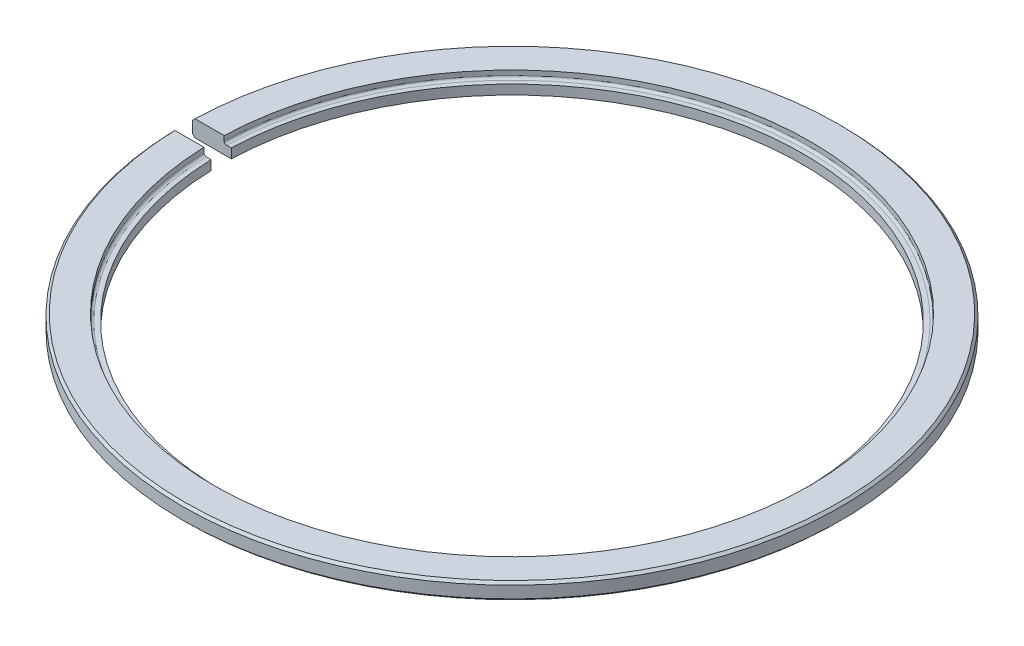
ISO-10303-21;
HEADER;
FILE_DESCRIPTION(('STEP AP214'),'2;1');
FILE_NAME('part.step','',(''),(''),'','','');
FILE_SCHEMA(('AUTOMOTIVE_DESIGN { 1 0 10303 214 1 1 1 1 }'));
ENDSEC;
DATA;
#1=APPLICATION_CONTEXT('core data for automotive mechanical design processes');
#2=APPLICATION_PROTOCOL_DEFINITION('international standard','automotive_design',2000,#1);
#3=PRODUCT_CONTEXT('',#1,'mechanical');
#4=PRODUCT('Part','Part','',(#3));
#5=PRODUCT_RELATED_PRODUCT_CATEGORY('part','',(#4));
#6=PRODUCT_DEFINITION_FORMATION('','',#4);
#7=PRODUCT_DEFINITION_CONTEXT('part definition',#1,'design');
#8=PRODUCT_DEFINITION('design','',#6,#7);
#9=PRODUCT_DEFINITION_SHAPE('','',#8);
#10=(LENGTH_UNIT() NAMED_UNIT(*) SI_UNIT(.MILLI.,.METRE.));
#11=(NAMED_UNIT(*) PLANE_ANGLE_UNIT() SI_UNIT($,.RADIAN.));
#12=(NAMED_UNIT(*) SI_UNIT($,.STERADIAN.) SOLID_ANGLE_UNIT());
#13=UNCERTAINTY_MEASURE_WITH_UNIT(LENGTH_MEASURE(1.E-05),#10,'distance_accuracy_value','');
#14=(GEOMETRIC_REPRESENTATION_CONTEXT(3) GLOBAL_UNCERTAINTY_ASSIGNED_CONTEXT((#13)) GLOBAL_UNIT_ASSIGNED_CONTEXT((#10,
#11,#12)) REPRESENTATION_CONTEXT('',''));
#15=CARTESIAN_POINT('',(0.,0.,0.));
#16=DIRECTION('',(0.,0.,1.));
#17=DIRECTION('',(1.,0.,0.));
#18=AXIS2_PLACEMENT_3D('',#15,#16,#17);
#19=CARTESIAN_POINT('',(35.2425,1.778,0.));
#20=DIRECTION('',(0.,0.999999999999999,0.));
#21=DIRECTION('',(0.,0.,0.999999999999999));
#22=AXIS2_PLACEMENT_3D('',#19,#20,#21);
#23=PLANE('',#22);
#24=DIRECTION('',(1.,0.,0.));
#25=VECTOR('',#24,1.);
#26=CARTESIAN_POINT('',(-35.2425,1.778,1.0795));
#27=LINE('',#26,#25);
#28=CARTESIAN_POINT('',(-34.9718431312964,1.778,1.07950000000001));
#29=VERTEX_POINT('',#28);
#30=CARTESIAN_POINT('',(-31.8587163700925,1.778,1.07950000000002));
#31=VERTEX_POINT('',#30);
#32=EDGE_CURVE('E123',#29,#31,#27,.T.);
#33=ORIENTED_EDGE('',*,*,#32,.F.);
#34=CARTESIAN_POINT('',(0.,1.778,0.));
#35=DIRECTION('',(0.,0.999999999999999,0.));
#36=DIRECTION('',(0.,0.,0.999999999999999));
#37=AXIS2_PLACEMENT_3D('',#34,#35,#36);
#38=CIRCLE('',#37,34.9885);
#39=CARTESIAN_POINT('',(-34.9718431312964,1.778,-1.07949999999997));
#40=VERTEX_POINT('',#39);
#41=EDGE_CURVE('E166',#29,#40,#38,.T.);
#42=ORIENTED_EDGE('',*,*,#41,.T.);
#43=DIRECTION('',(-1.,0.,0.));
#44=VECTOR('',#43,1.);
#45=CARTESIAN_POINT('',(-35.2425,1.77799999999997,-1.07949999999998));
#46=LINE('',#45,#44);
#47=CARTESIAN_POINT('',(-31.8587163700925,1.778,-1.07950000000001));
#48=VERTEX_POINT('',#47);
#49=EDGE_CURVE('E65',#48,#40,#46,.T.);
#50=ORIENTED_EDGE('',*,*,#49,.F.);
#51=CARTESIAN_POINT('',(0.,1.778,0.));
#52=DIRECTION('',(0.,-0.999999999999999,0.));
#53=DIRECTION('',(0.,0.,-0.999999999999999));
#54=AXIS2_PLACEMENT_3D('',#51,#52,#53);
#55=CIRCLE('',#54,31.877);
#56=EDGE_CURVE('E141',#48,#31,#55,.T.);
#57=ORIENTED_EDGE('',*,*,#56,.T.);
#58=EDGE_LOOP('',(#33,#42,#50,#57));
#59=FACE_BOUND('',#58,.T.);
#60=ADVANCED_FACE('F38',(#59),#23,.T.);
#61=CARTESIAN_POINT('',(0.,0.,0.));
#62=DIRECTION('',(0.,-0.999999999999999,0.));
#63=DIRECTION('',(0.,0.,-0.999999999999999));
#64=AXIS2_PLACEMENT_3D('',#61,#62,#63);
#65=CYLINDRICAL_SURFACE('',#64,31.877);
#66=DIRECTION('',(0.,-0.999999999999999,0.));
#67=VECTOR('',#66,1.);
#68=CARTESIAN_POINT('',(-31.8587163700925,0.,1.07950000000001));
#69=LINE('',#68,#67);
#70=CARTESIAN_POINT('',(-31.8587163700925,1.26999999999999,1.07950000000002));
#71=VERTEX_POINT('',#70);
#72=EDGE_CURVE('E138',#31,#71,#69,.T.);
#73=ORIENTED_EDGE('',*,*,#72,.F.);
#74=ORIENTED_EDGE('',*,*,#56,.F.);
#75=DIRECTION('',(0.,-0.999999999999999,0.));
#76=VECTOR('',#75,1.);
#77=CARTESIAN_POINT('',(-31.8587163700925,0.,-1.0795));
#78=LINE('',#77,#76);
#79=CARTESIAN_POINT('',(-31.8587163700926,1.26999999999999,-1.07950000000001));
#80=VERTEX_POINT('',#79);
#81=EDGE_CURVE('E221',#80,#48,#78,.F.);
#82=ORIENTED_EDGE('',*,*,#81,.F.);
#83=CARTESIAN_POINT('',(0.,1.26999999999999,0.));
#84=DIRECTION('',(0.,0.999999999999999,0.));
#85=DIRECTION('',(0.,0.,0.999999999999999));
#86=AXIS2_PLACEMENT_3D('',#83,#84,#85);
#87=CIRCLE('',#86,31.877);
#88=EDGE_CURVE('E150',#80,#71,#87,.F.);
#89=ORIENTED_EDGE('',*,*,#88,.T.);
#90=EDGE_LOOP('',(#73,#74,#82,#89));
#91=FACE_BOUND('',#90,.T.);
#92=ADVANCED_FACE('F228',(#91),#65,.F.);
#93=CARTESIAN_POINT('',(31.877,1.01600000000002,0.));
#94=DIRECTION('',(0.,0.999999999999999,0.));
#95=DIRECTION('',(0.,0.,0.999999999999999));
#96=AXIS2_PLACEMENT_3D('',#93,#94,#95);
#97=PLANE('',#96);
#98=DIRECTION('',(1.,0.,0.));
#99=VECTOR('',#98,1.);
#100=CARTESIAN_POINT('',(31.877,1.01599999999999,1.07950000000001));
#101=LINE('',#100,#99);
#102=CARTESIAN_POINT('',(-31.6045694283279,1.01599999999999,1.0795));
#103=VERTEX_POINT('',#102);
#104=CARTESIAN_POINT('',(-31.0962683412335,1.01599999999999,1.07950000000001));
#105=VERTEX_POINT('',#104);
#106=EDGE_CURVE('E143',#103,#105,#101,.T.);
#107=ORIENTED_EDGE('',*,*,#106,.F.);
#108=CARTESIAN_POINT('',(0.,1.01599999999999,0.));
#109=DIRECTION('',(0.,0.999999999999999,0.));
#110=DIRECTION('',(0.,0.,0.999999999999999));
#111=AXIS2_PLACEMENT_3D('',#108,#109,#110);
#112=CIRCLE('',#111,31.623);
#113=CARTESIAN_POINT('',(-31.6045694283279,1.01599999999999,-1.07949999999999));
#114=VERTEX_POINT('',#113);
#115=EDGE_CURVE('E154',#103,#114,#112,.T.);
#116=ORIENTED_EDGE('',*,*,#115,.T.);
#117=DIRECTION('',(-1.,0.,0.));
#118=VECTOR('',#117,1.);
#119=CARTESIAN_POINT('',(31.877,1.01600000000002,-1.07949999999999));
#120=LINE('',#119,#118);
#121=CARTESIAN_POINT('',(-31.0962683412335,1.01599999999999,-1.07949999999999));
#122=VERTEX_POINT('',#121);
#123=EDGE_CURVE('E219',#122,#114,#120,.T.);
#124=ORIENTED_EDGE('',*,*,#123,.F.);
#125=CARTESIAN_POINT('',(0.,1.01599999999999,0.));
#126=DIRECTION('',(0.,-0.999999999999999,0.));
#127=DIRECTION('',(0.,0.,-0.999999999999999));
#128=AXIS2_PLACEMENT_3D('',#125,#126,#127);
#129=CIRCLE('',#128,31.115);
#130=EDGE_CURVE('E132',#122,#105,#129,.T.);
#131=ORIENTED_EDGE('',*,*,#130,.T.);
#132=EDGE_LOOP('',(#107,#116,#124,#131));
#133=FACE_BOUND('',#132,.T.);
#134=ADVANCED_FACE('F218',(#133),#97,.T.);
#135=CARTESIAN_POINT('',(0.,0.,0.));
#136=DIRECTION('',(0.,-0.999999999999999,0.));
#137=DIRECTION('',(0.,0.,-0.999999999999999));
#138=AXIS2_PLACEMENT_3D('',#135,#136,#137);
#139=CYLINDRICAL_SURFACE('',#138,31.115);
#140=DIRECTION('',(0.,0.999999999999999,0.));
#141=VECTOR('',#140,1.);
#142=CARTESIAN_POINT('',(-31.0962683412335,0.,1.07950000000001));
#143=LINE('',#142,#141);
#144=CARTESIAN_POINT('',(-31.0962683412335,0.,1.07950000000001));
#145=VERTEX_POINT('',#144);
#146=EDGE_CURVE('E133',#145,#105,#143,.T.);
#147=ORIENTED_EDGE('',*,*,#146,.T.);
#148=ORIENTED_EDGE('',*,*,#130,.F.);
#149=DIRECTION('',(0.,0.999999999999999,0.));
#150=VECTOR('',#149,1.);
#151=CARTESIAN_POINT('',(-31.0962683412335,0.,-1.0795));
#152=LINE('',#151,#150);
#153=CARTESIAN_POINT('',(-31.0962683412335,0.,-1.0795));
#154=VERTEX_POINT('',#153);
#155=EDGE_CURVE('E114',#154,#122,#152,.T.);
#156=ORIENTED_EDGE('',*,*,#155,.F.);
#157=CARTESIAN_POINT('',(0.,0.,0.));
#158=DIRECTION('',(0.,-0.999999999999999,0.));
#159=DIRECTION('',(0.,0.,-0.999999999999999));
#160=AXIS2_PLACEMENT_3D('',#157,#158,#159);
#161=CIRCLE('',#160,31.115);
#162=EDGE_CURVE('E130',#154,#145,#161,.T.);
#163=ORIENTED_EDGE('',*,*,#162,.T.);
#164=EDGE_LOOP('',(#147,#148,#156,#163));
#165=FACE_BOUND('',#164,.T.);
#166=ADVANCED_FACE('F129',(#165),#139,.F.);
#167=CARTESIAN_POINT('',(31.115,0.,0.));
#168=DIRECTION('',(0.,-0.999999999999999,0.));
#169=DIRECTION('',(0.,0.,-0.999999999999999));
#170=AXIS2_PLACEMENT_3D('',#167,#168,#169);
#171=PLANE('',#170);
#172=DIRECTION('',(1.,0.,0.));
#173=VECTOR('',#172,1.);
#174=CARTESIAN_POINT('',(-35.2425,0.,1.0795));
#175=LINE('',#174,#173);
#176=CARTESIAN_POINT('',(-34.9718431312963,0.,1.07950000000001));
#177=VERTEX_POINT('',#176);
#178=EDGE_CURVE('E122',#177,#145,#175,.T.);
#179=ORIENTED_EDGE('',*,*,#178,.T.);
#180=ORIENTED_EDGE('',*,*,#162,.F.);
#181=DIRECTION('',(-1.,0.,0.));
#182=VECTOR('',#181,1.);
#183=CARTESIAN_POINT('',(-35.2425,0.,-1.07949999999998));
#184=LINE('',#183,#182);
#185=CARTESIAN_POINT('',(-34.9718431312963,0.,-1.07949999999998));
#186=VERTEX_POINT('',#185);
#187=EDGE_CURVE('E111',#154,#186,#184,.T.);
#188=ORIENTED_EDGE('',*,*,#187,.T.);
#189=CARTESIAN_POINT('',(0.,0.,0.));
#190=DIRECTION('',(0.,-0.999999999999999,0.));
#191=DIRECTION('',(0.,0.,-0.999999999999999));
#192=AXIS2_PLACEMENT_3D('',#189,#190,#191);
#193=CIRCLE('',#192,34.9885);
#194=EDGE_CURVE('E158',#186,#177,#193,.T.);
#195=ORIENTED_EDGE('',*,*,#194,.T.);
#196=EDGE_LOOP('',(#179,#180,#188,#195));
#197=FACE_BOUND('',#196,.T.);
#198=ADVANCED_FACE('F136',(#197),#171,.T.);
#199=CARTESIAN_POINT('',(0.,0.,0.));
#200=DIRECTION('',(0.,-0.999999999999999,0.));
#201=DIRECTION('',(0.,0.,-0.999999999999999));
#202=AXIS2_PLACEMENT_3D('',#199,#200,#201);
#203=CYLINDRICAL_SURFACE('',#202,35.2425);
#204=DIRECTION('',(0.,-0.999999999999999,0.));
#205=VECTOR('',#204,1.);
#206=CARTESIAN_POINT('',(-35.2259632373623,0.,1.07950000000001));
#207=LINE('',#206,#205);
#208=CARTESIAN_POINT('',(-35.2259632373623,0.254000000000004,1.0795));
#209=VERTEX_POINT('',#208);
#210=CARTESIAN_POINT('',(-35.2259632373623,1.524,1.07950000000002));
#211=VERTEX_POINT('',#210);
#212=EDGE_CURVE('E57',#209,#211,#207,.F.);
#213=ORIENTED_EDGE('',*,*,#212,.F.);
#214=CARTESIAN_POINT('',(0.,0.254000000000004,0.));
#215=DIRECTION('',(0.,-0.999999999999999,0.));
#216=DIRECTION('',(0.,0.,-0.999999999999999));
#217=AXIS2_PLACEMENT_3D('',#214,#215,#216);
#218=CIRCLE('',#217,35.2425);
#219=CARTESIAN_POINT('',(-35.2259632373623,0.254000000000004,-1.07949999999998));
#220=VERTEX_POINT('',#219);
#221=EDGE_CURVE('E163',#209,#220,#218,.F.);
#222=ORIENTED_EDGE('',*,*,#221,.T.);
#223=DIRECTION('',(0.,-0.999999999999999,0.));
#224=VECTOR('',#223,1.);
#225=CARTESIAN_POINT('',(-35.2259632373623,0.,-1.07949999999997));
#226=LINE('',#225,#224);
#227=CARTESIAN_POINT('',(-35.2259632373623,1.52400000000003,-1.07949999999998));
#228=VERTEX_POINT('',#227);
#229=EDGE_CURVE('E189',#228,#220,#226,.T.);
#230=ORIENTED_EDGE('',*,*,#229,.F.);
#231=CARTESIAN_POINT('',(0.,1.52400000000003,0.));
#232=DIRECTION('',(0.,0.999999999999999,0.));
#233=DIRECTION('',(0.,0.,0.999999999999999));
#234=AXIS2_PLACEMENT_3D('',#231,#232,#233);
#235=CIRCLE('',#234,35.2425);
#236=EDGE_CURVE('E160',#228,#211,#235,.F.);
#237=ORIENTED_EDGE('',*,*,#236,.T.);
#238=EDGE_LOOP('',(#213,#222,#230,#237));
#239=FACE_BOUND('',#238,.T.);
#240=ADVANCED_FACE('F178',(#239),#203,.T.);
#241=CARTESIAN_POINT('',(0.,1.26999999999999,0.));
#242=DIRECTION('',(0.,0.999999999999999,0.));
#243=DIRECTION('',(0.,0.,0.999999999999999));
#244=AXIS2_PLACEMENT_3D('',#241,#242,#243);
#245=TOROIDAL_SURFACE('',#244,31.623,0.254);
#246=ORIENTED_EDGE('',*,*,#115,.F.);
#247=CARTESIAN_POINT('',(-31.8101411720625,1.12065079264931,1.07950000000002));
#248=CARTESIAN_POINT('',(-31.8185301511686,1.1321855521033,1.07950000000003));
#249=CARTESIAN_POINT('',(-31.8259514478052,1.14443689707371,1.0795));
#250=CARTESIAN_POINT('',(-31.8386379050443,1.1700218782661,1.07949999999999));
#251=CARTESIAN_POINT('',(-31.8439004722611,1.18335679333659,1.07950000000001));
#252=CARTESIAN_POINT('',(-31.852109416914,1.21071611376443,1.07950000000001));
#253=CARTESIAN_POINT('',(-31.8550568618022,1.22474019818775,1.0795));
#254=CARTESIAN_POINT('',(-31.8585539276637,1.25308035170716,1.07949999999999));
#255=CARTESIAN_POINT('',(-31.8591041427289,1.26739634757682,1.0795));
#256=CARTESIAN_POINT('',(-31.8577931067473,1.29591588283525,1.0795));
#257=CARTESIAN_POINT('',(-31.8559321377629,1.31011943518223,1.07949999999999));
#258=CARTESIAN_POINT('',(-31.849852022551,1.33801304828465,1.0795));
#259=CARTESIAN_POINT('',(-31.8456327852139,1.35170308917925,1.07950000000001));
#260=CARTESIAN_POINT('',(-31.8349561220557,1.37818093040764,1.07950000000001));
#261=CARTESIAN_POINT('',(-31.8284986542952,1.39096871382977,1.0795));
#262=CARTESIAN_POINT('',(-31.8135292705695,1.41527917951978,1.0795));
#263=CARTESIAN_POINT('',(-31.8050173553974,1.42680186227601,1.07950000000001));
#264=CARTESIAN_POINT('',(-31.7861774108758,1.44825985856393,1.07950000000001));
#265=CARTESIAN_POINT('',(-31.775848695886,1.45819457010137,1.0795));
#266=CARTESIAN_POINT('',(-31.7536707958325,1.47619008645344,1.0795));
#267=CARTESIAN_POINT('',(-31.7418216090667,1.4842508891702,1.07950000000001));
#268=CARTESIAN_POINT('',(-31.7169320800483,1.49827454224588,1.07950000000001));
#269=CARTESIAN_POINT('',(-31.7038910806655,1.5042362263151,1.0795));
#270=CARTESIAN_POINT('',(-31.6769936127817,1.5138868196153,1.0795));
#271=CARTESIAN_POINT('',(-31.6631371410051,1.51757571971652,1.07950000000001));
#272=CARTESIAN_POINT('',(-31.6349947507689,1.52257771245773,1.07950000000001));
#273=CARTESIAN_POINT('',(-31.6207086239142,1.52388963266623,1.0795));
#274=CARTESIAN_POINT('',(-31.5921188370643,1.52409699122471,1.0795));
#275=CARTESIAN_POINT('',(-31.5778151770458,1.52299242636946,1.07950000000001));
#276=CARTESIAN_POINT('',(-31.5495931197666,1.51839755135021,1.07950000000001));
#277=CARTESIAN_POINT('',(-31.5356748066281,1.51490672446548,1.0795));
#278=CARTESIAN_POINT('',(-31.5086219251776,1.50563757243708,1.0795));
#279=CARTESIAN_POINT('',(-31.4954873567388,1.49985924766351,1.07950000000001));
#280=CARTESIAN_POINT('',(-31.4703772210561,1.48617982779673,1.07950000000001));
#281=CARTESIAN_POINT('',(-31.4584014696192,1.47827907081909,1.0795));
#282=CARTESIAN_POINT('',(-31.4359471688808,1.46057825848148,1.0795));
#283=CARTESIAN_POINT('',(-31.4254686161932,1.45077820741713,1.07950000000001));
#284=CARTESIAN_POINT('',(-31.4063115283724,1.42956182355029,1.07950000000001));
#285=CARTESIAN_POINT('',(-31.3976321509639,1.41814625127731,1.0795));
#286=CARTESIAN_POINT('',(-31.3823144010679,1.39401930018353,1.0795));
#287=CARTESIAN_POINT('',(-31.375676022189,1.38130792542068,1.07950000000001));
#288=CARTESIAN_POINT('',(-31.3646326769615,1.3549580446011,1.07950000000001));
#289=CARTESIAN_POINT('',(-31.360226430851,1.34132007489319,1.0795));
#290=CARTESIAN_POINT('',(-31.3537671919766,1.31349780938685,1.07949999999999));
#291=CARTESIAN_POINT('',(-31.3517141925046,1.2993135151459,1.0795));
#292=CARTESIAN_POINT('',(-31.3500203313828,1.27080767751808,1.0795));
#293=CARTESIAN_POINT('',(-31.3503784481284,1.25648619482699,1.0795));
#294=CARTESIAN_POINT('',(-31.3534942015741,1.22810668026152,1.0795));
#295=CARTESIAN_POINT('',(-31.3562518367393,1.21404864821861,1.0795));
#296=CARTESIAN_POINT('',(-31.3640877378048,1.18659623357363,1.07949999999999));
#297=CARTESIAN_POINT('',(-31.3691658114113,1.17320179608166,1.07949999999999));
#298=CARTESIAN_POINT('',(-31.3814979703066,1.14745523194142,1.0795));
#299=CARTESIAN_POINT('',(-31.388752055678,1.1351031053327,1.07950000000002));
#300=CARTESIAN_POINT('',(-31.4052323788638,1.11178774104085,1.07950000000002));
#301=CARTESIAN_POINT('',(-31.4144591959164,1.10082491279588,1.0795));
#302=CARTESIAN_POINT('',(-31.434621488918,1.0806028496382,1.0795));
#303=CARTESIAN_POINT('',(-31.4455569726094,1.07134362244548,1.07950000000002));
#304=CARTESIAN_POINT('',(-31.4688324193362,1.05478627083638,1.07950000000002));
#305=CARTESIAN_POINT('',(-31.4811731345124,1.04748920374314,1.0795));
#306=CARTESIAN_POINT('',(-31.50690400119,1.03506914801082,1.07949999999999));
#307=CARTESIAN_POINT('',(-31.5202941580934,1.02994617056339,1.07950000000001));
#308=CARTESIAN_POINT('',(-31.5477518660156,1.0220168816282,1.07950000000001));
#309=CARTESIAN_POINT('',(-31.5618197941379,1.01921187595895,1.0795));
#310=CARTESIAN_POINT('',(-31.5902263457418,1.01600279984819,1.0795));
#311=CARTESIAN_POINT('',(-31.6045649591798,1.01559864050001,1.07950000000001));
#312=CARTESIAN_POINT('',(-31.6331095178377,1.01720251600643,1.07950000000001));
#313=CARTESIAN_POINT('',(-31.647315435299,1.01921104466417,1.0795));
#314=CARTESIAN_POINT('',(-31.6751922294907,1.02558549855592,1.0795));
#315=CARTESIAN_POINT('',(-31.6888629723036,1.02995200983818,1.07950000000001));
#316=CARTESIAN_POINT('',(-31.7152815838878,1.04092012443965,1.07950000000001));
#317=CARTESIAN_POINT('',(-31.7280290636614,1.04752266328896,1.07949999999999));
#318=CARTESIAN_POINT('',(-31.7522221259278,1.06277116917428,1.0795));
#319=CARTESIAN_POINT('',(-31.7636692578431,1.07141466567589,1.07950000000003));
#320=CARTESIAN_POINT('',(-31.7809537536898,1.08691374619261,1.07950000000002));
#321=CARTESIAN_POINT('',(-31.7872863999788,1.09322647282789,1.0795));
#322=CARTESIAN_POINT('',(-31.7992529600382,1.10648269325755,1.0795));
#323=CARTESIAN_POINT('',(-31.8048868738637,1.11342618700226,1.07950000000002));
#324=CARTESIAN_POINT('',(-31.8101411720625,1.12065079264931,1.07950000000002));
#325=B_SPLINE_CURVE_WITH_KNOTS('',3,(#247,#248,#249,#250,#251,#252,#253,#254,#255,#256,#257,
#258,#259,#260,#261,#262,#263,#264,#265,#266,#267,#268,#269,#270,#271,#272,#273,#274,#275,#276,
#277,#278,#279,#280,#281,#282,#283,#284,#285,#286,#287,#288,#289,#290,#291,#292,#293,#294,#295,
#296,#297,#298,#299,#300,#301,#302,#303,#304,#305,#306,#307,#308,#309,#310,#311,#312,#313,#314,
#315,#316,#317,#318,#319,#320,#321,#322,#323,#324),.UNSPECIFIED.,.T.,.F.,(4,2,2,2,2,2,2,2,2,2,2,
2,2,2,2,2,2,2,2,2,2,2,2,2,2,2,2,2,2,2,2,2,2,2,2,2,2,2,4),(0.,0.0427556199426644,
0.0855624548964128,0.12834954095182,0.171126022721881,0.213897500913214,0.256670631655053,
0.299444563911516,0.342218479657144,0.385008572579851,0.427798713406372,0.470612591453271,
0.513426641482384,0.556261803549259,0.599097022432794,0.64194151978568,0.684786010206564,
0.727623679298739,0.770461251506133,0.813278723991406,0.856096062393343,0.898888824217681,
0.941681464056205,0.984455973534542,1.02723045564926,1.07000139370081,1.11277233337486,
1.15555584884329,1.19833955818358,1.24114627582204,1.28395321381572,1.32678425048898,
1.36961370105978,1.4124519189974,1.45530078876265,1.4981676082319,1.540982801985,
1.56776207890306,1.59454135371265),.UNSPECIFIED.);
#326=EDGE_CURVE('E209',#103,#71,#325,.T.);
#327=ORIENTED_EDGE('',*,*,#326,.T.);
#328=ORIENTED_EDGE('',*,*,#88,.F.);
#329=CARTESIAN_POINT('',(-31.8101411720625,1.12065079264931,-1.07950000000001));
#330=CARTESIAN_POINT('',(-31.8017446977226,1.10910788107683,-1.07950000000002));
#331=CARTESIAN_POINT('',(-31.792366860341,1.09826591702534,-1.07949999999998));
#332=CARTESIAN_POINT('',(-31.7719157830095,1.07830176771544,-1.07949999999998));
#333=CARTESIAN_POINT('',(-31.7608405037196,1.06918168096775,-1.07950000000001));
#334=CARTESIAN_POINT('',(-31.7373204909696,1.05293423993354,-1.07950000000001));
#335=CARTESIAN_POINT('',(-31.7248764463706,1.04580588959934,-1.07949999999998));
#336=CARTESIAN_POINT('',(-31.6989719821207,1.03374070467421,-1.07949999999998));
#337=CARTESIAN_POINT('',(-31.6855118157418,1.02880332607194,-1.07950000000001));
#338=CARTESIAN_POINT('',(-31.6579471122185,1.02125474040434,-1.07950000000001));
#339=CARTESIAN_POINT('',(-31.6438422626186,1.01864467414767,-1.07949999999999));
#340=CARTESIAN_POINT('',(-31.6153940253604,1.01582869976194,-1.07949999999998));
#341=CARTESIAN_POINT('',(-31.6010506278173,1.01562289150961,-1.07949999999999));
#342=CARTESIAN_POINT('',(-31.5725285959671,1.01762175640554,-1.07949999999999));
#343=CARTESIAN_POINT('',(-31.5583500104598,1.01982712599549,-1.07949999999998));
#344=CARTESIAN_POINT('',(-31.53056438381,1.02658706189805,-1.07949999999999));
#345=CARTESIAN_POINT('',(-31.5169573416909,1.03114162419687,-1.07950000000001));
#346=CARTESIAN_POINT('',(-31.4907019882094,1.04247070901866,-1.07950000000001));
#347=CARTESIAN_POINT('',(-31.4780536242724,1.04924510969541,-1.07949999999998));
#348=CARTESIAN_POINT('',(-31.4540743741918,1.06482203504605,-1.07949999999998));
#349=CARTESIAN_POINT('',(-31.4427434833358,1.07362455246517,-1.07950000000001));
#350=CARTESIAN_POINT('',(-31.4217257937253,1.09300421969547,-1.07950000000001));
#351=CARTESIAN_POINT('',(-31.412038338471,1.10358065750877,-1.07949999999999));
#352=CARTESIAN_POINT('',(-31.3945777714711,1.12621061462167,-1.07949999999998));
#353=CARTESIAN_POINT('',(-31.3868046559246,1.13826413098834,-1.07949999999999));
#354=CARTESIAN_POINT('',(-31.3733981392826,1.16349869659126,-1.0795));
#355=CARTESIAN_POINT('',(-31.3677635186356,1.17667909791072,-1.07949999999998));
#356=CARTESIAN_POINT('',(-31.3587882857246,1.20379908436681,-1.07949999999998));
#357=CARTESIAN_POINT('',(-31.3554476656805,1.21773866692843,-1.07949999999999));
#358=CARTESIAN_POINT('',(-31.3511567258006,1.24597402174602,-1.07949999999999));
#359=CARTESIAN_POINT('',(-31.3502052410139,1.26026961697331,-1.07949999999998));
#360=CARTESIAN_POINT('',(-31.3507163000696,1.28881758029578,-1.07949999999998));
#361=CARTESIAN_POINT('',(-31.3521788404076,1.30306994845368,-1.0795));
#362=CARTESIAN_POINT('',(-31.3574757661538,1.33112411757658,-1.07949999999999));
#363=CARTESIAN_POINT('',(-31.3613097091183,1.34492600208484,-1.07949999999998));
#364=CARTESIAN_POINT('',(-31.371239869499,1.3716903973299,-1.07949999999999));
#365=CARTESIAN_POINT('',(-31.3773360879974,1.3846529076652,-1.07950000000001));
#366=CARTESIAN_POINT('',(-31.3916187685841,1.40937350668345,-1.07950000000001));
#367=CARTESIAN_POINT('',(-31.3998056454709,1.42113135570537,-1.07949999999999));
#368=CARTESIAN_POINT('',(-31.4180362681871,1.44310657547125,-1.07949999999998));
#369=CARTESIAN_POINT('',(-31.4280800185284,1.45332394247183,-1.0795));
#370=CARTESIAN_POINT('',(-31.4497445092631,1.47193363785305,-1.0795));
#371=CARTESIAN_POINT('',(-31.4613660266157,1.48032506172947,-1.07949999999998));
#372=CARTESIAN_POINT('',(-31.4858522586845,1.49503902632614,-1.07949999999999));
#373=CARTESIAN_POINT('',(-31.4987169771855,1.50136156074766,-1.07950000000001));
#374=CARTESIAN_POINT('',(-31.5253322865231,1.51176197588083,-1.07950000000001));
#375=CARTESIAN_POINT('',(-31.5390833770931,1.51583857775855,-1.07949999999999));
#376=CARTESIAN_POINT('',(-31.5670746743857,1.52162632754516,-1.07949999999998));
#377=CARTESIAN_POINT('',(-31.581314882559,1.52333746843796,-1.0795));
#378=CARTESIAN_POINT('',(-31.6098861426069,1.52434610357651,-1.0795));
#379=CARTESIAN_POINT('',(-31.6242172279431,1.52364265022782,-1.07949999999998));
#380=CARTESIAN_POINT('',(-31.6525579212912,1.51983987887596,-1.07949999999999));
#381=CARTESIAN_POINT('',(-31.6665675293763,1.51674056141787,-1.07950000000001));
#382=CARTESIAN_POINT('',(-31.693868143394,1.50823354558433,-1.07950000000001));
#383=CARTESIAN_POINT('',(-31.7071591169665,1.50282574335523,-1.07949999999999));
#384=CARTESIAN_POINT('',(-31.732644148193,1.48985483576362,-1.07949999999998));
#385=CARTESIAN_POINT('',(-31.7448382052267,1.48229172918223,-1.0795));
#386=CARTESIAN_POINT('',(-31.7677789129281,1.46522729610806,-1.0795));
#387=CARTESIAN_POINT('',(-31.778526024125,1.45572658874111,-1.07949999999998));
#388=CARTESIAN_POINT('',(-31.7982716345097,1.43505484331284,-1.07949999999999));
#389=CARTESIAN_POINT('',(-31.8072701350073,1.42388380650262,-1.07950000000001));
#390=CARTESIAN_POINT('',(-31.8232580204621,1.40019472474367,-1.07950000000001));
#391=CARTESIAN_POINT('',(-31.8302484462439,1.38767738225276,-1.07949999999999));
#392=CARTESIAN_POINT('',(-31.8420270300326,1.36164678745675,-1.07949999999998));
#393=CARTESIAN_POINT('',(-31.8468152813183,1.34813357736237,-1.07949999999999));
#394=CARTESIAN_POINT('',(-31.8540512177536,1.3205035832801,-1.0795));
#395=CARTESIAN_POINT('',(-31.8565003727397,1.3063871841576,-1.07949999999998));
#396=CARTESIAN_POINT('',(-31.8589936307718,1.27793969530294,-1.07949999999998));
#397=CARTESIAN_POINT('',(-31.8590371401594,1.26360855344995,-1.0795));
#398=CARTESIAN_POINT('',(-31.8567170689753,1.23514105050572,-1.0795));
#399=CARTESIAN_POINT('',(-31.8543530234439,1.22100472757342,-1.07949999999998));
#400=CARTESIAN_POINT('',(-31.8472853145509,1.19334205887816,-1.07949999999998));
#401=CARTESIAN_POINT('',(-31.8425844720943,1.17981499905293,-1.0795));
#402=CARTESIAN_POINT('',(-31.8331705289309,1.15865651919769,-1.07949999999999));
#403=CARTESIAN_POINT('',(-31.8291264131003,1.1507204864229,-1.07949999999998));
#404=CARTESIAN_POINT('',(-31.820229064864,1.13531575382926,-1.07949999999999));
#405=CARTESIAN_POINT('',(-31.8153758325682,1.12784705394696,-1.0795));
#406=CARTESIAN_POINT('',(-31.8101411720625,1.12065079264931,-1.07950000000001));
#407=B_SPLINE_CURVE_WITH_KNOTS('',3,(#329,#330,#331,#332,#333,#334,#335,#336,#337,#338,#339,
#340,#341,#342,#343,#344,#345,#346,#347,#348,#349,#350,#351,#352,#353,#354,#355,#356,#357,#358,
#359,#360,#361,#362,#363,#364,#365,#366,#367,#368,#369,#370,#371,#372,#373,#374,#375,#376,#377,
#378,#379,#380,#381,#382,#383,#384,#385,#386,#387,#388,#389,#390,#391,#392,#393,#394,#395,#396,
#397,#398,#399,#400,#401,#402,#403,#404,#405,#406),.UNSPECIFIED.,.T.,.F.,(4,2,2,2,2,2,2,2,2,2,2,
2,2,2,2,2,2,2,2,2,2,2,2,2,2,2,2,2,2,2,2,2,2,2,2,2,2,2,4),(0.,0.0427887092697084,
0.0856292346526588,0.128448297410448,0.171256722373626,0.214086119776338,0.256917296374455,
0.299760847546881,0.342604325517765,0.385445452217435,0.428286425672445,0.471110245028326,
0.513933979353652,0.556733255113941,0.599532385715458,0.642310643249769,0.685088838684814,
0.727859055198483,0.770629292170525,0.813408021601313,0.856186854982793,0.898986831405281,
0.941786938131048,0.984611390115655,1.02743596911971,1.07027735631905,1.11311873377152,
1.15596203876628,1.19880536799005,1.24163502877967,1.28446465748979,1.32727204653987,
1.37007762220362,1.41285628205663,1.4556454986576,1.49844298050346,1.5411889236286,
1.56786492927621,1.59454093130228),.UNSPECIFIED.);
#408=EDGE_CURVE('E188',#80,#114,#407,.T.);
#409=ORIENTED_EDGE('',*,*,#408,.T.);
#410=EDGE_LOOP('',(#246,#327,#328,#409));
#411=FACE_BOUND('',#410,.T.);
#412=ADVANCED_FACE('F197',(#411),#245,.F.);
#413=CARTESIAN_POINT('',(0.,0.,0.));
#414=DIRECTION('',(0.,0.999999999999999,0.));
#415=DIRECTION('',(0.,0.,0.999999999999999));
#416=AXIS2_PLACEMENT_3D('',#413,#414,#415);
#417=CONICAL_SURFACE('',#416,34.9885,0.785398163397462);
#418=CARTESIAN_POINT('',(-29.6052374552661,-5.36358810084495,1.07950000000002));
#419=CARTESIAN_POINT('',(-31.3740481336208,-3.59590506932647,1.0795));
#420=CARTESIAN_POINT('',(-33.142793135463,-1.82815632916425,1.0795));
#421=CARTESIAN_POINT('',(-36.6801517853808,1.70747256770636,1.0795));
#422=CARTESIAN_POINT('',(-38.4487654334564,3.47535272441469,1.07950000000001));
#423=CARTESIAN_POINT('',(-40.2173134050196,5.24329858976671,1.07950000000002));
#424=B_SPLINE_CURVE_WITH_KNOTS('',3,(#418,#419,#420,#421,#422,#423),.UNSPECIFIED.,.F.,.F.,(4,2,
4),(0.,7.50203641746581,15.0040728317857),.UNSPECIFIED.);
#425=EDGE_CURVE('E203',#177,#209,#424,.T.);
#426=ORIENTED_EDGE('',*,*,#425,.F.);
#427=ORIENTED_EDGE('',*,*,#194,.F.);
#428=CARTESIAN_POINT('',(-40.2173134050196,5.24329858976671,-1.07949999999998));
#429=CARTESIAN_POINT('',(-38.4487654334564,3.47535272441468,-1.07949999999998));
#430=CARTESIAN_POINT('',(-36.6801517853808,1.70747256770634,-1.07949999999998));
#431=CARTESIAN_POINT('',(-33.1427931354631,-1.82815632916427,-1.07949999999999));
#432=CARTESIAN_POINT('',(-31.3740481336208,-3.59590506932648,-1.0795));
#433=CARTESIAN_POINT('',(-29.6052374552661,-5.36358810084495,-1.07950000000001));
#434=B_SPLINE_CURVE_WITH_KNOTS('',3,(#428,#429,#430,#431,#432,#433),.UNSPECIFIED.,.F.,.F.,(4,2,
4),(0.,7.50203641431987,15.0040728317857),.UNSPECIFIED.);
#435=EDGE_CURVE('E117',#220,#186,#434,.T.);
#436=ORIENTED_EDGE('',*,*,#435,.F.);
#437=ORIENTED_EDGE('',*,*,#221,.F.);
#438=EDGE_LOOP('',(#426,#427,#436,#437));
#439=FACE_BOUND('',#438,.T.);
#440=ADVANCED_FACE('F194',(#439),#417,.T.);
#441=CARTESIAN_POINT('',(0.,1.52400000000003,0.));
#442=DIRECTION('',(0.,-0.999999999999999,0.));
#443=DIRECTION('',(0.,0.,-0.999999999999999));
#444=AXIS2_PLACEMENT_3D('',#441,#442,#443);
#445=CONICAL_SURFACE('',#444,35.2425,0.785398163397462);
#446=CARTESIAN_POINT('',(-40.2173134050196,-3.46529858976669,1.07950000000002));
#447=CARTESIAN_POINT('',(-38.4487654334564,-1.69735272441468,1.07950000000002));
#448=CARTESIAN_POINT('',(-36.6801517853808,0.0705274322936426,1.07950000000001));
#449=CARTESIAN_POINT('',(-33.1427931354631,3.60615632916423,1.07950000000001));
#450=CARTESIAN_POINT('',(-31.3740481336208,5.37390506932645,1.07950000000001));
#451=CARTESIAN_POINT('',(-29.6052374552661,7.14158810084492,1.07950000000001));
#452=B_SPLINE_CURVE_WITH_KNOTS('',3,(#446,#447,#448,#449,#450,#451),.UNSPECIFIED.,.F.,.F.,(4,2,
4),(0.,7.50203641431986,15.0040728317856),.UNSPECIFIED.);
#453=EDGE_CURVE('E11',#211,#29,#452,.T.);
#454=ORIENTED_EDGE('',*,*,#453,.F.);
#455=ORIENTED_EDGE('',*,*,#236,.F.);
#456=CARTESIAN_POINT('',(-29.6052374552661,7.14158810084495,-1.07950000000001));
#457=CARTESIAN_POINT('',(-31.3740481336208,5.37390506932647,-1.07949999999999));
#458=CARTESIAN_POINT('',(-33.1427931354631,3.60615632916425,-1.07949999999997));
#459=CARTESIAN_POINT('',(-36.6801517853808,0.0705274322936452,-1.07949999999996));
#460=CARTESIAN_POINT('',(-38.4487654334564,-1.69735272441468,-1.07949999999997));
#461=CARTESIAN_POINT('',(-40.2173134050196,-3.46529858976669,-1.07949999999998));
#462=B_SPLINE_CURVE_WITH_KNOTS('',3,(#456,#457,#458,#459,#460,#461),.UNSPECIFIED.,.F.,.F.,(4,2,
4),(0.,7.5020364174658,15.0040728317856),.UNSPECIFIED.);
#463=EDGE_CURVE('E51',#40,#228,#462,.T.);
#464=ORIENTED_EDGE('',*,*,#463,.F.);
#465=ORIENTED_EDGE('',*,*,#41,.F.);
#466=EDGE_LOOP('',(#454,#455,#464,#465));
#467=FACE_BOUND('',#466,.T.);
#468=ADVANCED_FACE('F40',(#467),#445,.T.);
#469=CARTESIAN_POINT('',(-35.2425,0.,-1.07949999999998));
#470=DIRECTION('',(0.,0.,-0.999999999999999));
#471=DIRECTION('',(-1.,0.,0.));
#472=AXIS2_PLACEMENT_3D('',#469,#470,#471);
#473=PLANE('',#472);
#474=ORIENTED_EDGE('',*,*,#81,.T.);
#475=ORIENTED_EDGE('',*,*,#49,.T.);
#476=ORIENTED_EDGE('',*,*,#463,.T.);
#477=ORIENTED_EDGE('',*,*,#229,.T.);
#478=ORIENTED_EDGE('',*,*,#435,.T.);
#479=ORIENTED_EDGE('',*,*,#187,.F.);
#480=ORIENTED_EDGE('',*,*,#155,.T.);
#481=ORIENTED_EDGE('',*,*,#123,.T.);
#482=ORIENTED_EDGE('',*,*,#408,.F.);
#483=EDGE_LOOP('',(#474,#475,#476,#477,#478,#479,#480,#481,#482));
#484=FACE_BOUND('',#483,.T.);
#485=ADVANCED_FACE('F113',(#484),#473,.F.);
#486=CARTESIAN_POINT('',(-35.2425,0.,1.0795));
#487=DIRECTION('',(0.,0.,0.999999999999999));
#488=DIRECTION('',(1.,0.,0.));
#489=AXIS2_PLACEMENT_3D('',#486,#487,#488);
#490=PLANE('',#489);
#491=ORIENTED_EDGE('',*,*,#72,.T.);
#492=ORIENTED_EDGE('',*,*,#326,.F.);
#493=ORIENTED_EDGE('',*,*,#106,.T.);
#494=ORIENTED_EDGE('',*,*,#146,.F.);
#495=ORIENTED_EDGE('',*,*,#178,.F.);
#496=ORIENTED_EDGE('',*,*,#425,.T.);
#497=ORIENTED_EDGE('',*,*,#212,.T.);
#498=ORIENTED_EDGE('',*,*,#453,.T.);
#499=ORIENTED_EDGE('',*,*,#32,.T.);
#500=EDGE_LOOP('',(#491,#492,#493,#494,#495,#496,#497,#498,#499));
#501=FACE_BOUND('',#500,.T.);
#502=ADVANCED_FACE('F176',(#501),#490,.F.);
#503=CLOSED_SHELL('',(#60,#92,#134,#166,#198,#240,#412,#440,#468,#485,#502));
#504=MANIFOLD_SOLID_BREP('B2',#503);
#505=ADVANCED_BREP_SHAPE_REPRESENTATION('',(#18,#504),#14);
#506=SHAPE_DEFINITION_REPRESENTATION(#9,#505);
ENDSEC;
END-ISO-10303-21;
